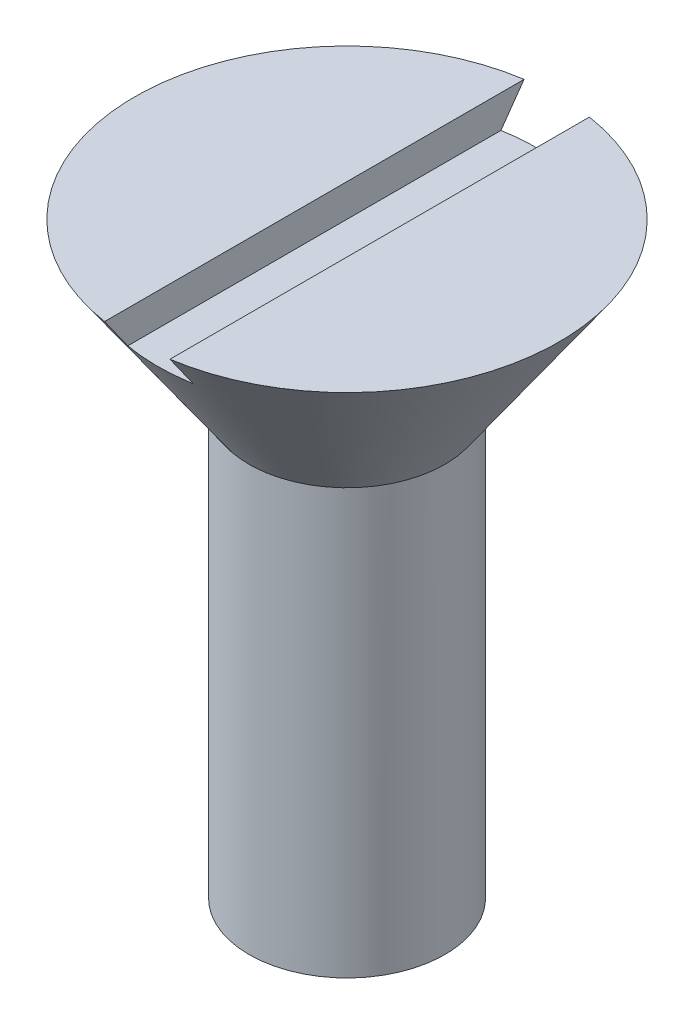
ISO-10303-21;
HEADER;
FILE_DESCRIPTION(('STEP AP214'),'2;1');
FILE_NAME('part.step','',(''),(''),'','','');
FILE_SCHEMA(('AUTOMOTIVE_DESIGN { 1 0 10303 214 1 1 1 1 }'));
ENDSEC;
DATA;
#1=APPLICATION_CONTEXT('core data for automotive mechanical design processes');
#2=APPLICATION_PROTOCOL_DEFINITION('international standard','automotive_design',2000,#1);
#3=PRODUCT_CONTEXT('',#1,'mechanical');
#4=PRODUCT('Part','Part','',(#3));
#5=PRODUCT_RELATED_PRODUCT_CATEGORY('part','',(#4));
#6=PRODUCT_DEFINITION_FORMATION('','',#4);
#7=PRODUCT_DEFINITION_CONTEXT('part definition',#1,'design');
#8=PRODUCT_DEFINITION('design','',#6,#7);
#9=PRODUCT_DEFINITION_SHAPE('','',#8);
#10=(LENGTH_UNIT() NAMED_UNIT(*) SI_UNIT(.MILLI.,.METRE.));
#11=(NAMED_UNIT(*) PLANE_ANGLE_UNIT() SI_UNIT($,.RADIAN.));
#12=(NAMED_UNIT(*) SI_UNIT($,.STERADIAN.) SOLID_ANGLE_UNIT());
#13=UNCERTAINTY_MEASURE_WITH_UNIT(LENGTH_MEASURE(1.E-05),#10,'distance_accuracy_value','');
#14=(GEOMETRIC_REPRESENTATION_CONTEXT(3) GLOBAL_UNCERTAINTY_ASSIGNED_CONTEXT((#13)) GLOBAL_UNIT_ASSIGNED_CONTEXT((#10,
#11,#12)) REPRESENTATION_CONTEXT('',''));
#15=CARTESIAN_POINT('',(0.,0.,0.));
#16=DIRECTION('',(0.,0.,1.));
#17=DIRECTION('',(1.,0.,0.));
#18=AXIS2_PLACEMENT_3D('',#15,#16,#17);
#19=CARTESIAN_POINT('',(0.,0.,0.));
#20=DIRECTION('',(0.,1.,0.));
#21=DIRECTION('',(0.,0.,1.));
#22=AXIS2_PLACEMENT_3D('',#19,#20,#21);
#23=CONICAL_SURFACE('',#22,6.5,0.610725964389209);
#24=CARTESIAN_POINT('',(0.,-5.,0.));
#25=DIRECTION('',(0.,-1.,0.));
#26=DIRECTION('',(0.,0.,-1.));
#27=AXIS2_PLACEMENT_3D('',#24,#25,#26);
#28=CIRCLE('',#27,3.);
#29=CARTESIAN_POINT('',(0.,-5.,-3.));
#30=VERTEX_POINT('',#29);
#31=EDGE_CURVE('E95',#30,#30,#28,.T.);
#32=ORIENTED_EDGE('',*,*,#31,.F.);
#33=EDGE_LOOP('',(#32));
#34=FACE_BOUND('',#33,.T.);
#35=CARTESIAN_POINT('',(1.,0.000699999999999853,-6.4231121927069));
#36=CARTESIAN_POINT('',(1.,-0.250402973210665,-6.24521507547194));
#37=CARTESIAN_POINT('',(1.,-0.501430348754825,-6.06721105785793));
#38=CARTESIAN_POINT('',(1.,-1.00328543473532,-5.71088793330972));
#39=CARTESIAN_POINT('',(1.,-1.25411313141089,-5.53256880699693));
#40=CARTESIAN_POINT('',(1.,-1.75624717314771,-5.17499647886702));
#41=CARTESIAN_POINT('',(1.,-2.00755266877063,-4.99574208349889));
#42=CARTESIAN_POINT('',(1.,-2.50975864588096,-4.63669913452875));
#43=CARTESIAN_POINT('',(1.,-2.76065915109721,-4.45691061411516));
#44=CARTESIAN_POINT('',(1.,-3.32066567942009,-4.05434246098987));
#45=CARTESIAN_POINT('',(1.,-3.6296292578344,-3.83136424535591));
#46=CARTESIAN_POINT('',(1.,-4.09206747695826,-3.49544297230533));
#47=CARTESIAN_POINT('',(1.,-4.24606151106159,-3.38321524822286));
#48=CARTESIAN_POINT('',(1.,-4.55357761222401,-3.15811915839283));
#49=CARTESIAN_POINT('',(1.,-4.70709968602468,-3.04525080186236));
#50=CARTESIAN_POINT('',(1.,-5.01310136529784,-2.81893473483323));
#51=CARTESIAN_POINT('',(1.,-5.16558264221546,-2.70548928810727));
#52=CARTESIAN_POINT('',(1.,-5.4696305535057,-2.47735955209802));
#53=CARTESIAN_POINT('',(1.,-5.62119713375148,-2.36267519060135));
#54=CARTESIAN_POINT('',(1.,-5.92289177437992,-2.13153400820381));
#55=CARTESIAN_POINT('',(1.,-6.07302034770651,-2.01507786083154));
#56=CARTESIAN_POINT('',(1.,-6.29649432515915,-1.83823431248961));
#57=CARTESIAN_POINT('',(1.,-6.37069560583634,-1.77892951008025));
#58=CARTESIAN_POINT('',(1.,-6.51833236747371,-1.65937552484643));
#59=CARTESIAN_POINT('',(1.,-6.59176787191012,-1.59912637111531));
#60=CARTESIAN_POINT('',(1.,-6.71365973362481,-1.49735496061013));
#61=CARTESIAN_POINT('',(1.,-6.76240331660418,-1.45617701216027));
#62=CARTESIAN_POINT('',(1.,-6.85929593016329,-1.37311830533831));
#63=CARTESIAN_POINT('',(1.,-6.90744491465203,-1.33123749306917));
#64=CARTESIAN_POINT('',(1.,-7.00314777347609,-1.24644783826052));
#65=CARTESIAN_POINT('',(1.,-7.05069880836868,-1.20353578171963));
#66=CARTESIAN_POINT('',(1.,-7.14476589149895,-1.11660199553977));
#67=CARTESIAN_POINT('',(1.,-7.19128210747752,-1.07258044824988));
#68=CARTESIAN_POINT('',(1.,-7.28171784528769,-0.984258875571617));
#69=CARTESIAN_POINT('',(1.,-7.32567344502512,-0.93999597831939));
#70=CARTESIAN_POINT('',(1.,-7.41170748248033,-0.849685965186152));
#71=CARTESIAN_POINT('',(1.,-7.45378642200475,-0.803639332492839));
#72=CARTESIAN_POINT('',(1.,-7.53499857979571,-0.709408627074625));
#73=CARTESIAN_POINT('',(1.,-7.5741457763169,-0.661236704334912));
#74=CARTESIAN_POINT('',(1.,-7.64825600880549,-0.561804744039557));
#75=CARTESIAN_POINT('',(1.,-7.68322653705196,-0.51055049189075));
#76=CARTESIAN_POINT('',(1.,-7.72761842246045,-0.435811432213111));
#77=CARTESIAN_POINT('',(1.,-7.73983903465967,-0.413994672182494));
#78=CARTESIAN_POINT('',(1.,-7.76294754857883,-0.369660988832996));
#79=CARTESIAN_POINT('',(1.,-7.77383497797314,-0.347143820893278));
#80=CARTESIAN_POINT('',(1.,-7.80400329022563,-0.278664441259216));
#81=CARTESIAN_POINT('',(1.,-7.8209086427829,-0.231583649581735));
#82=CARTESIAN_POINT('',(1.,-7.84352580818615,-0.143751659910726));
#83=CARTESIAN_POINT('',(1.,-7.85070500394181,-0.103387133416545));
#84=CARTESIAN_POINT('',(1.,-7.85797486648315,-0.0219594036923849));
#85=CARTESIAN_POINT('',(1.,-7.85806047775887,0.0191042769698415));
#86=CARTESIAN_POINT('',(1.,-7.8511205139962,0.100503321516521));
#87=CARTESIAN_POINT('',(1.,-7.84411070636894,0.140840098426749));
#88=CARTESIAN_POINT('',(1.,-7.82406213975653,0.219934025983461));
#89=CARTESIAN_POINT('',(1.,-7.81102230238593,0.258690892735777));
#90=CARTESIAN_POINT('',(1.,-7.78188033002872,0.330465253321086));
#91=CARTESIAN_POINT('',(1.,-7.76621918682467,0.363667547268319));
#92=CARTESIAN_POINT('',(1.,-7.7320600585327,0.428595619012454));
#93=CARTESIAN_POINT('',(1.,-7.71355951008278,0.46032002852787));
#94=CARTESIAN_POINT('',(1.,-7.67433228656222,0.522585950662289));
#95=CARTESIAN_POINT('',(1.,-7.6535940232754,0.553120070167368));
#96=CARTESIAN_POINT('',(1.,-7.61050564213084,0.612996566707754));
#97=CARTESIAN_POINT('',(1.,-7.58815626111847,0.642339479063717));
#98=CARTESIAN_POINT('',(1.,-7.51783485578599,0.730686952033599));
#99=CARTESIAN_POINT('',(1.,-7.46786171803238,0.788092695306644));
#100=CARTESIAN_POINT('',(1.,-7.36473606932233,0.899994752825909));
#101=CARTESIAN_POINT('',(1.,-7.31158074042107,0.95448840502532));
#102=CARTESIAN_POINT('',(1.,-7.20306181203031,1.06149306115468));
#103=CARTESIAN_POINT('',(1.,-7.14769308022235,1.11399883295359));
#104=CARTESIAN_POINT('',(1.,-7.03551697028456,1.21745270602296));
#105=CARTESIAN_POINT('',(1.,-6.97870941712556,1.26840061610315));
#106=CARTESIAN_POINT('',(1.,-6.8636311606969,1.36949512242315));
#107=CARTESIAN_POINT('',(1.,-6.80535267353112,1.41963282838062));
#108=CARTESIAN_POINT('',(1.,-6.688011529651,1.51898955075173));
#109=CARTESIAN_POINT('',(1.,-6.62894880619912,1.56820848811068));
#110=CARTESIAN_POINT('',(1.,-6.51033141743061,1.66583472159215));
#111=CARTESIAN_POINT('',(1.,-6.45077779885167,1.7142432918876));
#112=CARTESIAN_POINT('',(1.,-6.33120593130732,1.81047784179123));
#113=CARTESIAN_POINT('',(1.,-6.27118769885126,1.85830384194615));
#114=CARTESIAN_POINT('',(1.,-6.08157815972822,2.00819700899556));
#115=CARTESIAN_POINT('',(1.,-5.95131874461286,2.10941865781123));
#116=CARTESIAN_POINT('',(1.,-5.68969473050544,2.31042525016909));
#117=CARTESIAN_POINT('',(1.,-5.5583300968116,2.4102101483313));
#118=CARTESIAN_POINT('',(1.,-5.2948218166097,2.60877175431693));
#119=CARTESIAN_POINT('',(1.,-5.16267809559565,2.70754836316461));
#120=CARTESIAN_POINT('',(1.,-4.8978363693623,2.90435620432972));
#121=CARTESIAN_POINT('',(1.,-4.76513836088278,3.00238743225337));
#122=CARTESIAN_POINT('',(1.,-4.36613967246596,3.29586613365335));
#123=CARTESIAN_POINT('',(1.,-4.09922627089918,3.49048011542739));
#124=CARTESIAN_POINT('',(1.,-3.56444630719685,3.87835826017651));
#125=CARTESIAN_POINT('',(1.,-3.29657980020395,4.07162249938512));
#126=CARTESIAN_POINT('',(1.,-2.77654815539002,4.44551854449072));
#127=CARTESIAN_POINT('',(1.,-2.52442061432676,4.62620266343094));
#128=CARTESIAN_POINT('',(1.,-2.0197670589774,4.98702305613861));
#129=CARTESIAN_POINT('',(1.,-1.76724103743863,5.16715931975581));
#130=CARTESIAN_POINT('',(1.,-1.2622650319287,5.52677185493383));
#131=CARTESIAN_POINT('',(1.,-1.00981545797447,5.70624870244838));
#132=CARTESIAN_POINT('',(1.,-0.504702660936672,6.06489037383144));
#133=CARTESIAN_POINT('',(1.,-0.252039442419042,6.24405520412977));
#134=CARTESIAN_POINT('',(1.,0.000699999999999347,6.4231121927069));
#135=B_SPLINE_CURVE_WITH_KNOTS('',3,(#35,#36,#37,#38,#39,#40,#41,#42,#43,#44,#45,#46,#47,#48,
#49,#50,#51,#52,#53,#54,#55,#56,#57,#58,#59,#60,#61,#62,#63,#64,#65,#66,#67,#68,#69,#70,#71,#72,
#73,#74,#75,#76,#77,#78,#79,#80,#81,#82,#83,#84,#85,#86,#87,#88,#89,#90,#91,#92,#93,#94,#95,#96,
#97,#98,#99,#100,#101,#102,#103,#104,#105,#106,#107,#108,#109,#110,#111,#112,#113,#114,#115,
#116,#117,#118,#119,#120,#121,#122,#123,#124,#125,#126,#127,#128,#129,#130,#131,#132,#133,#134),
.UNSPECIFIED.,.F.,.F.,(4,2,2,2,2,2,2,2,2,2,2,2,2,2,2,2,2,2,2,2,2,2,2,2,2,2,2,2,2,2,2,2,2,2,2,2,
2,2,2,2,2,2,2,2,2,2,2,2,2,4),(0.,0.923201509240988,1.84646192008955,2.77251707641882,
3.69851584706987,4.8415765420185,5.41322473304253,5.98486472022837,6.55502115896761,
7.12521101202564,7.6951892752624,7.98015070767564,8.26510337825439,8.45652467666823,
8.64796072134151,8.84010072326167,9.03220934955081,9.2193134976021,9.40636731153534,
9.59246346676997,9.77822061490547,9.85319794763915,9.92820176727316,10.0775406581727,
10.1999903842997,10.3225273780829,10.4447926671675,10.5670798301291,10.6770443346272,
10.7871087034044,10.8977732132442,11.0083874278571,11.2364917496226,11.4648011428321,
11.6936747166945,11.9225762674854,12.1531967152284,12.3838369158941,12.6140718598638,
12.844298660001,13.3391746463811,13.8340662293547,14.3290059335491,14.8239485529878,
15.8149277270123,16.8058504703305,17.7364058749223,18.6669784163907,19.5962168450814,
20.5254358925289),.UNSPECIFIED.);
#136=CARTESIAN_POINT('',(1.,0.,-6.42261628933256));
#137=VERTEX_POINT('',#136);
#138=CARTESIAN_POINT('',(1.,-1.,-5.71314274283428));
#139=VERTEX_POINT('',#138);
#140=EDGE_CURVE('E100',#137,#139,#135,.T.);
#141=ORIENTED_EDGE('',*,*,#140,.F.);
#142=CARTESIAN_POINT('',(0.,0.,0.));
#143=DIRECTION('',(0.,-1.,0.));
#144=DIRECTION('',(0.,0.,-1.));
#145=AXIS2_PLACEMENT_3D('',#142,#143,#144);
#146=CIRCLE('',#145,6.5);
#147=CARTESIAN_POINT('',(1.,0.,6.42261628933256));
#148=VERTEX_POINT('',#147);
#149=EDGE_CURVE('E91',#137,#148,#146,.T.);
#150=ORIENTED_EDGE('',*,*,#149,.T.);
#151=CARTESIAN_POINT('',(1.,-1.,5.71314274283428));
#152=VERTEX_POINT('',#151);
#153=EDGE_CURVE('E101',#152,#148,#135,.T.);
#154=ORIENTED_EDGE('',*,*,#153,.F.);
#155=CARTESIAN_POINT('',(0.,-1.,0.));
#156=DIRECTION('',(0.,1.,0.));
#157=DIRECTION('',(0.,0.,1.));
#158=AXIS2_PLACEMENT_3D('',#155,#156,#157);
#159=CIRCLE('',#158,5.8);
#160=CARTESIAN_POINT('',(-1.,-1.,5.71314274283428));
#161=VERTEX_POINT('',#160);
#162=EDGE_CURVE('E39',#161,#152,#159,.T.);
#163=ORIENTED_EDGE('',*,*,#162,.F.);
#164=CARTESIAN_POINT('',(-1.,0.000699999999999853,-6.4231121927069));
#165=CARTESIAN_POINT('',(-1.,-0.250402973210665,-6.24521507547194));
#166=CARTESIAN_POINT('',(-1.,-0.501430348754825,-6.06721105785793));
#167=CARTESIAN_POINT('',(-1.,-1.00328543473532,-5.71088793330972));
#168=CARTESIAN_POINT('',(-1.,-1.25411313141089,-5.53256880699693));
#169=CARTESIAN_POINT('',(-1.,-1.75624717314771,-5.17499647886702));
#170=CARTESIAN_POINT('',(-1.,-2.00755266877063,-4.99574208349889));
#171=CARTESIAN_POINT('',(-1.,-2.50975864588096,-4.63669913452875));
#172=CARTESIAN_POINT('',(-1.,-2.76065915109721,-4.45691061411516));
#173=CARTESIAN_POINT('',(-1.,-3.32066567942009,-4.05434246098987));
#174=CARTESIAN_POINT('',(-1.,-3.6296292578344,-3.83136424535591));
#175=CARTESIAN_POINT('',(-1.,-4.09206747695826,-3.49544297230533));
#176=CARTESIAN_POINT('',(-1.,-4.24606151106159,-3.38321524822286));
#177=CARTESIAN_POINT('',(-1.,-4.55357761222401,-3.15811915839283));
#178=CARTESIAN_POINT('',(-1.,-4.70709968602468,-3.04525080186236));
#179=CARTESIAN_POINT('',(-1.,-5.01310136529784,-2.81893473483323));
#180=CARTESIAN_POINT('',(-1.,-5.16558264221546,-2.70548928810727));
#181=CARTESIAN_POINT('',(-1.,-5.4696305535057,-2.47735955209802));
#182=CARTESIAN_POINT('',(-1.,-5.62119713375148,-2.36267519060135));
#183=CARTESIAN_POINT('',(-1.,-5.92289177437992,-2.13153400820381));
#184=CARTESIAN_POINT('',(-1.,-6.07302034770651,-2.01507786083154));
#185=CARTESIAN_POINT('',(-1.,-6.29649432515915,-1.83823431248961));
#186=CARTESIAN_POINT('',(-1.,-6.37069560583634,-1.77892951008025));
#187=CARTESIAN_POINT('',(-1.,-6.51833236747371,-1.65937552484643));
#188=CARTESIAN_POINT('',(-1.,-6.59176787191012,-1.59912637111531));
#189=CARTESIAN_POINT('',(-1.,-6.71365973362481,-1.49735496061013));
#190=CARTESIAN_POINT('',(-1.,-6.76240331660418,-1.45617701216027));
#191=CARTESIAN_POINT('',(-1.,-6.85929593016329,-1.37311830533831));
#192=CARTESIAN_POINT('',(-1.,-6.90744491465203,-1.33123749306917));
#193=CARTESIAN_POINT('',(-1.,-7.00314777347609,-1.24644783826052));
#194=CARTESIAN_POINT('',(-1.,-7.05069880836868,-1.20353578171963));
#195=CARTESIAN_POINT('',(-1.,-7.14476589149895,-1.11660199553977));
#196=CARTESIAN_POINT('',(-1.,-7.19128210747752,-1.07258044824988));
#197=CARTESIAN_POINT('',(-1.,-7.28171784528769,-0.984258875571617));
#198=CARTESIAN_POINT('',(-1.,-7.32567344502512,-0.93999597831939));
#199=CARTESIAN_POINT('',(-1.,-7.41170748248033,-0.849685965186152));
#200=CARTESIAN_POINT('',(-1.,-7.45378642200475,-0.803639332492839));
#201=CARTESIAN_POINT('',(-1.,-7.53499857979571,-0.709408627074625));
#202=CARTESIAN_POINT('',(-1.,-7.5741457763169,-0.661236704334912));
#203=CARTESIAN_POINT('',(-1.,-7.64825600880549,-0.561804744039557));
#204=CARTESIAN_POINT('',(-1.,-7.68322653705196,-0.51055049189075));
#205=CARTESIAN_POINT('',(-1.,-7.72761842246045,-0.435811432213111));
#206=CARTESIAN_POINT('',(-1.,-7.73983903465967,-0.413994672182494));
#207=CARTESIAN_POINT('',(-1.,-7.76294754857883,-0.369660988832996));
#208=CARTESIAN_POINT('',(-1.,-7.77383497797314,-0.347143820893278));
#209=CARTESIAN_POINT('',(-1.,-7.80400329022563,-0.278664441259216));
#210=CARTESIAN_POINT('',(-1.,-7.8209086427829,-0.231583649581735));
#211=CARTESIAN_POINT('',(-1.,-7.84352580818615,-0.143751659910726));
#212=CARTESIAN_POINT('',(-1.,-7.85070500394181,-0.103387133416545));
#213=CARTESIAN_POINT('',(-1.,-7.85797486648315,-0.0219594036923849));
#214=CARTESIAN_POINT('',(-1.,-7.85806047775887,0.0191042769698415));
#215=CARTESIAN_POINT('',(-1.,-7.8511205139962,0.100503321516521));
#216=CARTESIAN_POINT('',(-1.,-7.84411070636894,0.140840098426749));
#217=CARTESIAN_POINT('',(-1.,-7.82406213975653,0.219934025983461));
#218=CARTESIAN_POINT('',(-1.,-7.81102230238593,0.258690892735777));
#219=CARTESIAN_POINT('',(-1.,-7.78188033002872,0.330465253321086));
#220=CARTESIAN_POINT('',(-1.,-7.76621918682467,0.363667547268319));
#221=CARTESIAN_POINT('',(-1.,-7.7320600585327,0.428595619012454));
#222=CARTESIAN_POINT('',(-1.,-7.71355951008278,0.46032002852787));
#223=CARTESIAN_POINT('',(-1.,-7.67433228656222,0.522585950662289));
#224=CARTESIAN_POINT('',(-1.,-7.6535940232754,0.553120070167368));
#225=CARTESIAN_POINT('',(-1.,-7.61050564213084,0.612996566707754));
#226=CARTESIAN_POINT('',(-1.,-7.58815626111847,0.642339479063717));
#227=CARTESIAN_POINT('',(-1.,-7.51783485578599,0.730686952033599));
#228=CARTESIAN_POINT('',(-1.,-7.46786171803238,0.788092695306644));
#229=CARTESIAN_POINT('',(-1.,-7.36473606932233,0.899994752825909));
#230=CARTESIAN_POINT('',(-1.,-7.31158074042107,0.95448840502532));
#231=CARTESIAN_POINT('',(-1.,-7.20306181203031,1.06149306115468));
#232=CARTESIAN_POINT('',(-1.,-7.14769308022235,1.11399883295359));
#233=CARTESIAN_POINT('',(-1.,-7.03551697028456,1.21745270602296));
#234=CARTESIAN_POINT('',(-1.,-6.97870941712556,1.26840061610315));
#235=CARTESIAN_POINT('',(-1.,-6.8636311606969,1.36949512242315));
#236=CARTESIAN_POINT('',(-1.,-6.80535267353112,1.41963282838062));
#237=CARTESIAN_POINT('',(-1.,-6.688011529651,1.51898955075173));
#238=CARTESIAN_POINT('',(-1.,-6.62894880619912,1.56820848811068));
#239=CARTESIAN_POINT('',(-1.,-6.51033141743061,1.66583472159215));
#240=CARTESIAN_POINT('',(-1.,-6.45077779885167,1.7142432918876));
#241=CARTESIAN_POINT('',(-1.,-6.33120593130732,1.81047784179123));
#242=CARTESIAN_POINT('',(-1.,-6.27118769885126,1.85830384194615));
#243=CARTESIAN_POINT('',(-1.,-6.08157815972822,2.00819700899556));
#244=CARTESIAN_POINT('',(-1.,-5.95131874461286,2.10941865781123));
#245=CARTESIAN_POINT('',(-1.,-5.68969473050544,2.31042525016909));
#246=CARTESIAN_POINT('',(-1.,-5.5583300968116,2.4102101483313));
#247=CARTESIAN_POINT('',(-1.,-5.2948218166097,2.60877175431693));
#248=CARTESIAN_POINT('',(-1.,-5.16267809559565,2.70754836316461));
#249=CARTESIAN_POINT('',(-1.,-4.8978363693623,2.90435620432972));
#250=CARTESIAN_POINT('',(-1.,-4.76513836088278,3.00238743225337));
#251=CARTESIAN_POINT('',(-1.,-4.36613967246596,3.29586613365335));
#252=CARTESIAN_POINT('',(-1.,-4.09922627089918,3.49048011542739));
#253=CARTESIAN_POINT('',(-1.,-3.56444630719685,3.87835826017651));
#254=CARTESIAN_POINT('',(-1.,-3.29657980020395,4.07162249938512));
#255=CARTESIAN_POINT('',(-1.,-2.77654815539002,4.44551854449072));
#256=CARTESIAN_POINT('',(-1.,-2.52442061432676,4.62620266343094));
#257=CARTESIAN_POINT('',(-1.,-2.0197670589774,4.98702305613861));
#258=CARTESIAN_POINT('',(-1.,-1.76724103743863,5.16715931975581));
#259=CARTESIAN_POINT('',(-1.,-1.2622650319287,5.52677185493383));
#260=CARTESIAN_POINT('',(-1.,-1.00981545797447,5.70624870244838));
#261=CARTESIAN_POINT('',(-1.,-0.504702660936672,6.06489037383144));
#262=CARTESIAN_POINT('',(-1.,-0.252039442419042,6.24405520412977));
#263=CARTESIAN_POINT('',(-1.,0.000699999999999347,6.4231121927069));
#264=B_SPLINE_CURVE_WITH_KNOTS('',3,(#164,#165,#166,#167,#168,#169,#170,#171,#172,#173,#174,
#175,#176,#177,#178,#179,#180,#181,#182,#183,#184,#185,#186,#187,#188,#189,#190,#191,#192,#193,
#194,#195,#196,#197,#198,#199,#200,#201,#202,#203,#204,#205,#206,#207,#208,#209,#210,#211,#212,
#213,#214,#215,#216,#217,#218,#219,#220,#221,#222,#223,#224,#225,#226,#227,#228,#229,#230,#231,
#232,#233,#234,#235,#236,#237,#238,#239,#240,#241,#242,#243,#244,#245,#246,#247,#248,#249,#250,
#251,#252,#253,#254,#255,#256,#257,#258,#259,#260,#261,#262,#263),.UNSPECIFIED.,.F.,.F.,(4,2,2,
2,2,2,2,2,2,2,2,2,2,2,2,2,2,2,2,2,2,2,2,2,2,2,2,2,2,2,2,2,2,2,2,2,2,2,2,2,2,2,2,2,2,2,2,2,2,4),
(0.,0.923201509240988,1.84646192008955,2.77251707641882,3.69851584706987,4.8415765420185,
5.41322473304253,5.98486472022837,6.55502115896761,7.12521101202564,7.6951892752624,
7.98015070767564,8.26510337825439,8.45652467666823,8.64796072134151,8.84010072326167,
9.03220934955081,9.2193134976021,9.40636731153534,9.59246346676997,9.77822061490547,
9.85319794763915,9.92820176727316,10.0775406581727,10.1999903842997,10.3225273780829,
10.4447926671675,10.5670798301291,10.6770443346272,10.7871087034044,10.8977732132442,
11.0083874278571,11.2364917496226,11.4648011428321,11.6936747166945,11.9225762674854,
12.1531967152284,12.3838369158941,12.6140718598638,12.844298660001,13.3391746463811,
13.8340662293547,14.3290059335491,14.8239485529878,15.8149277270123,16.8058504703305,
17.7364058749223,18.6669784163907,19.5962168450814,20.5254358925289),.UNSPECIFIED.);
#265=CARTESIAN_POINT('',(-1.,0.,6.42261628933256));
#266=VERTEX_POINT('',#265);
#267=EDGE_CURVE('E76',#161,#266,#264,.T.);
#268=ORIENTED_EDGE('',*,*,#267,.T.);
#269=CARTESIAN_POINT('',(-1.,0.,-6.42261628933256));
#270=VERTEX_POINT('',#269);
#271=EDGE_CURVE('E86',#266,#270,#146,.T.);
#272=ORIENTED_EDGE('',*,*,#271,.T.);
#273=CARTESIAN_POINT('',(-1.,-1.,-5.71314274283428));
#274=VERTEX_POINT('',#273);
#275=EDGE_CURVE('E50',#270,#274,#264,.T.);
#276=ORIENTED_EDGE('',*,*,#275,.T.);
#277=EDGE_CURVE('E11',#139,#274,#159,.T.);
#278=ORIENTED_EDGE('',*,*,#277,.F.);
#279=EDGE_LOOP('',(#141,#150,#154,#163,#268,#272,#276,#278));
#280=FACE_BOUND('',#279,.T.);
#281=ADVANCED_FACE('F35',(#34,#280),#23,.T.);
#282=CARTESIAN_POINT('',(0.,0.,0.));
#283=DIRECTION('',(0.,-1.,0.));
#284=DIRECTION('',(0.,0.,-1.));
#285=AXIS2_PLACEMENT_3D('',#282,#283,#284);
#286=PLANE('',#285);
#287=DIRECTION('',(0.,0.,1.));
#288=VECTOR('',#287,1.);
#289=CARTESIAN_POINT('',(1.,0.,0.));
#290=LINE('',#289,#288);
#291=EDGE_CURVE('E81',#137,#148,#290,.T.);
#292=ORIENTED_EDGE('',*,*,#291,.T.);
#293=ORIENTED_EDGE('',*,*,#149,.F.);
#294=EDGE_LOOP('',(#292,#293));
#295=FACE_BOUND('',#294,.T.);
#296=ADVANCED_FACE('F129',(#295),#286,.F.);
#297=ORIENTED_EDGE('',*,*,#271,.F.);
#298=DIRECTION('',(0.,0.,1.));
#299=VECTOR('',#298,1.);
#300=CARTESIAN_POINT('',(-1.,0.,0.));
#301=LINE('',#300,#299);
#302=EDGE_CURVE('E73',#270,#266,#301,.T.);
#303=ORIENTED_EDGE('',*,*,#302,.F.);
#304=EDGE_LOOP('',(#297,#303));
#305=FACE_BOUND('',#304,.T.);
#306=ADVANCED_FACE('F90',(#305),#286,.F.);
#307=CARTESIAN_POINT('',(0.,-18.,0.));
#308=DIRECTION('',(0.,1.,0.));
#309=DIRECTION('',(0.,0.,1.));
#310=AXIS2_PLACEMENT_3D('',#307,#308,#309);
#311=CONICAL_SURFACE('',#310,3.,1.0471975511966);
#312=CARTESIAN_POINT('',(0.,-19.7320508075689,0.));
#313=VERTEX_POINT('',#312);
#314=VERTEX_LOOP('',#313);
#315=FACE_BOUND('',#314,.T.);
#316=CARTESIAN_POINT('',(0.,-18.,0.));
#317=DIRECTION('',(0.,-1.,0.));
#318=DIRECTION('',(0.,0.,-1.));
#319=AXIS2_PLACEMENT_3D('',#316,#317,#318);
#320=CIRCLE('',#319,3.);
#321=CARTESIAN_POINT('',(0.,-18.,-3.));
#322=VERTEX_POINT('',#321);
#323=EDGE_CURVE('E92',#322,#322,#320,.T.);
#324=ORIENTED_EDGE('',*,*,#323,.T.);
#325=EDGE_LOOP('',(#324));
#326=FACE_BOUND('',#325,.T.);
#327=ADVANCED_FACE('F125',(#315,#326),#311,.T.);
#328=CARTESIAN_POINT('',(0.,0.,0.));
#329=DIRECTION('',(0.,-1.,0.));
#330=DIRECTION('',(0.,0.,-1.));
#331=AXIS2_PLACEMENT_3D('',#328,#329,#330);
#332=CYLINDRICAL_SURFACE('',#331,3.);
#333=ORIENTED_EDGE('',*,*,#323,.F.);
#334=EDGE_LOOP('',(#333));
#335=FACE_BOUND('',#334,.T.);
#336=ORIENTED_EDGE('',*,*,#31,.T.);
#337=EDGE_LOOP('',(#336));
#338=FACE_BOUND('',#337,.T.);
#339=ADVANCED_FACE('F122',(#335,#338),#332,.T.);
#340=CARTESIAN_POINT('',(0.,-1.,0.));
#341=DIRECTION('',(0.,1.,0.));
#342=DIRECTION('',(0.,0.,1.));
#343=AXIS2_PLACEMENT_3D('',#340,#341,#342);
#344=PLANE('',#343);
#345=ORIENTED_EDGE('',*,*,#277,.T.);
#346=DIRECTION('',(0.,0.,1.));
#347=VECTOR('',#346,1.);
#348=CARTESIAN_POINT('',(-1.,-1.,0.));
#349=LINE('',#348,#347);
#350=EDGE_CURVE('E191',#274,#161,#349,.T.);
#351=ORIENTED_EDGE('',*,*,#350,.T.);
#352=ORIENTED_EDGE('',*,*,#162,.T.);
#353=DIRECTION('',(0.,0.,1.));
#354=VECTOR('',#353,1.);
#355=CARTESIAN_POINT('',(1.,-1.,0.));
#356=LINE('',#355,#354);
#357=EDGE_CURVE('E88',#139,#152,#356,.T.);
#358=ORIENTED_EDGE('',*,*,#357,.F.);
#359=EDGE_LOOP('',(#345,#351,#352,#358));
#360=FACE_BOUND('',#359,.T.);
#361=ADVANCED_FACE('F117',(#360),#344,.T.);
#362=CARTESIAN_POINT('',(1.,-1.,0.));
#363=DIRECTION('',(-1.,0.,0.));
#364=DIRECTION('',(0.,0.,1.));
#365=AXIS2_PLACEMENT_3D('',#362,#363,#364);
#366=PLANE('',#365);
#367=ORIENTED_EDGE('',*,*,#140,.T.);
#368=ORIENTED_EDGE('',*,*,#357,.T.);
#369=ORIENTED_EDGE('',*,*,#153,.T.);
#370=ORIENTED_EDGE('',*,*,#291,.F.);
#371=EDGE_LOOP('',(#367,#368,#369,#370));
#372=FACE_BOUND('',#371,.T.);
#373=ADVANCED_FACE('F113',(#372),#366,.T.);
#374=CARTESIAN_POINT('',(-1.,-1.,0.));
#375=DIRECTION('',(-1.,0.,0.));
#376=DIRECTION('',(0.,0.,1.));
#377=AXIS2_PLACEMENT_3D('',#374,#375,#376);
#378=PLANE('',#377);
#379=ORIENTED_EDGE('',*,*,#302,.T.);
#380=ORIENTED_EDGE('',*,*,#267,.F.);
#381=ORIENTED_EDGE('',*,*,#350,.F.);
#382=ORIENTED_EDGE('',*,*,#275,.F.);
#383=EDGE_LOOP('',(#379,#380,#381,#382));
#384=FACE_BOUND('',#383,.T.);
#385=ADVANCED_FACE('F75',(#384),#378,.F.);
#386=CLOSED_SHELL('',(#281,#296,#306,#327,#339,#361,#373,#385));
#387=MANIFOLD_SOLID_BREP('B2',#386);
#388=ADVANCED_BREP_SHAPE_REPRESENTATION('',(#18,#387),#14);
#389=SHAPE_DEFINITION_REPRESENTATION(#9,#388);
ENDSEC;
END-ISO-10303-21;
